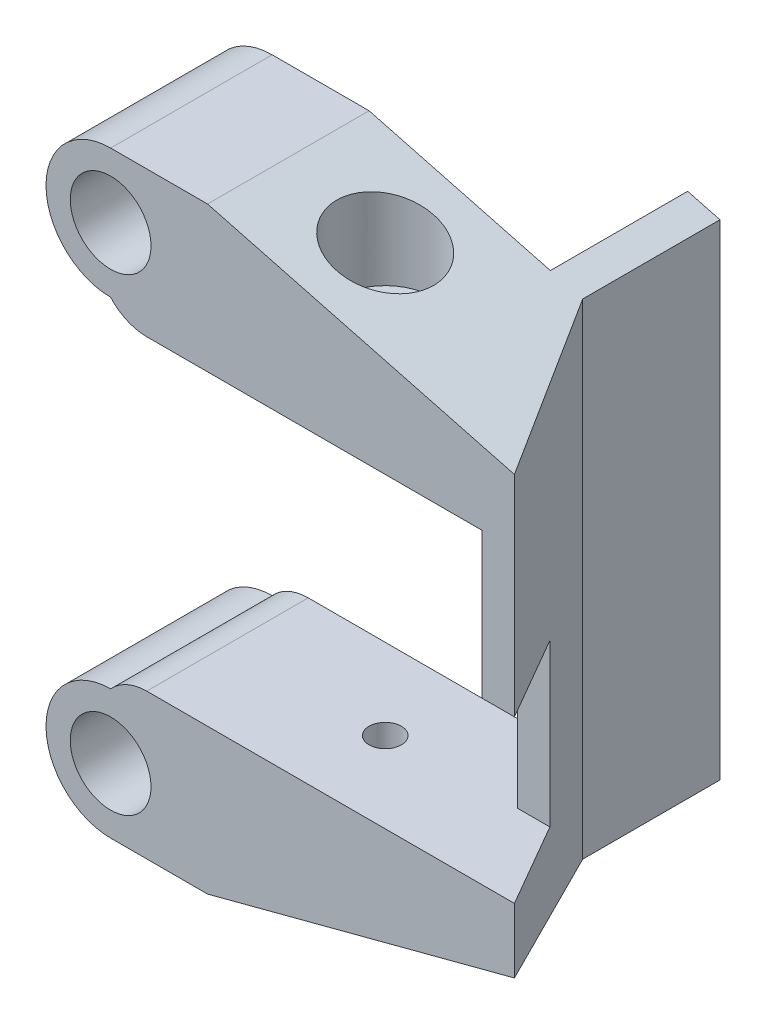
ISO-10303-21;
HEADER;
FILE_DESCRIPTION(('STEP AP214'),'2;1');
FILE_NAME('part.step','',(''),(''),'','','');
FILE_SCHEMA(('AUTOMOTIVE_DESIGN { 1 0 10303 214 1 1 1 1 }'));
ENDSEC;
DATA;
#1=APPLICATION_CONTEXT('core data for automotive mechanical design processes');
#2=APPLICATION_PROTOCOL_DEFINITION('international standard','automotive_design',2000,#1);
#3=PRODUCT_CONTEXT('',#1,'mechanical');
#4=PRODUCT('Part','Part','',(#3));
#5=PRODUCT_RELATED_PRODUCT_CATEGORY('part','',(#4));
#6=PRODUCT_DEFINITION_FORMATION('','',#4);
#7=PRODUCT_DEFINITION_CONTEXT('part definition',#1,'design');
#8=PRODUCT_DEFINITION('design','',#6,#7);
#9=PRODUCT_DEFINITION_SHAPE('','',#8);
#10=(LENGTH_UNIT() NAMED_UNIT(*) SI_UNIT(.MILLI.,.METRE.));
#11=(NAMED_UNIT(*) PLANE_ANGLE_UNIT() SI_UNIT($,.RADIAN.));
#12=(NAMED_UNIT(*) SI_UNIT($,.STERADIAN.) SOLID_ANGLE_UNIT());
#13=UNCERTAINTY_MEASURE_WITH_UNIT(LENGTH_MEASURE(1.E-05),#10,'distance_accuracy_value','');
#14=(GEOMETRIC_REPRESENTATION_CONTEXT(3) GLOBAL_UNCERTAINTY_ASSIGNED_CONTEXT((#13)) GLOBAL_UNIT_ASSIGNED_CONTEXT((#10,
#11,#12)) REPRESENTATION_CONTEXT('',''));
#15=CARTESIAN_POINT('',(0.,0.,0.));
#16=DIRECTION('',(0.,0.,1.));
#17=DIRECTION('',(1.,0.,0.));
#18=AXIS2_PLACEMENT_3D('',#15,#16,#17);
#19=CARTESIAN_POINT('',(-131.23163521819,17.7006515426684,10.));
#20=DIRECTION('',(0.,0.,1.));
#21=DIRECTION('',(1.,0.,0.));
#22=AXIS2_PLACEMENT_3D('',#19,#20,#21);
#23=PLANE('',#22);
#24=CARTESIAN_POINT('',(-131.23163521819,46.7006515426684,10.));
#25=DIRECTION('',(0.,0.,-1.));
#26=DIRECTION('',(1.,0.,0.));
#27=AXIS2_PLACEMENT_3D('',#24,#25,#26);
#28=CIRCLE('',#27,4.);
#29=CARTESIAN_POINT('',(-131.23163521819,42.7006515426684,10.));
#30=VERTEX_POINT('',#29);
#31=CARTESIAN_POINT('',(-131.23163521819,50.7006515426684,10.));
#32=VERTEX_POINT('',#31);
#33=EDGE_CURVE('E215',#30,#32,#28,.T.);
#34=ORIENTED_EDGE('',*,*,#33,.F.);
#35=CARTESIAN_POINT('',(-128.99556724069,44.7006515426684,10.));
#36=DIRECTION('',(0.,0.,1.));
#37=DIRECTION('',(1.,0.,0.));
#38=AXIS2_PLACEMENT_3D('',#35,#36,#37);
#39=CIRCLE('',#38,3.);
#40=CARTESIAN_POINT('',(-128.99556724069,41.7006515426684,10.));
#41=VERTEX_POINT('',#40);
#42=EDGE_CURVE('E203',#30,#41,#39,.T.);
#43=ORIENTED_EDGE('',*,*,#42,.T.);
#44=DIRECTION('',(-1.,0.,0.));
#45=VECTOR('',#44,1.);
#46=CARTESIAN_POINT('',(-106.23163521819,41.7006515426684,10.));
#47=LINE('',#46,#45);
#48=CARTESIAN_POINT('',(-108.23163521819,41.7006515426684,10.));
#49=VERTEX_POINT('',#48);
#50=EDGE_CURVE('E212',#49,#41,#47,.T.);
#51=ORIENTED_EDGE('',*,*,#50,.F.);
#52=DIRECTION('',(0.,-1.,0.));
#53=VECTOR('',#52,1.);
#54=CARTESIAN_POINT('',(-108.23163521819,32.2006515426684,10.));
#55=LINE('',#54,#53);
#56=CARTESIAN_POINT('',(-108.23163521819,32.7006515426684,10.));
#57=VERTEX_POINT('',#56);
#58=EDGE_CURVE('E195',#49,#57,#55,.T.);
#59=ORIENTED_EDGE('',*,*,#58,.T.);
#60=DIRECTION('',(-1.,0.,0.));
#61=VECTOR('',#60,1.);
#62=CARTESIAN_POINT('',(-108.23163521819,32.7006515426684,10.));
#63=LINE('',#62,#61);
#64=CARTESIAN_POINT('',(-106.23163521819,32.7006515426684,10.));
#65=VERTEX_POINT('',#64);
#66=EDGE_CURVE('E175',#65,#57,#63,.T.);
#67=ORIENTED_EDGE('',*,*,#66,.F.);
#68=DIRECTION('',(0.,1.,0.));
#69=VECTOR('',#68,1.);
#70=CARTESIAN_POINT('',(-106.23163521819,22.7006515426684,10.));
#71=LINE('',#70,#69);
#72=CARTESIAN_POINT('',(-106.23163521819,45.7006515426684,10.));
#73=VERTEX_POINT('',#72);
#74=EDGE_CURVE('E303',#65,#73,#71,.T.);
#75=ORIENTED_EDGE('',*,*,#74,.T.);
#76=DIRECTION('',(-0.967074537262646,0.254493299279644,0.));
#77=VECTOR('',#76,1.);
#78=CARTESIAN_POINT('',(-125.23163521819,50.7006515426684,10.));
#79=LINE('',#78,#77);
#80=CARTESIAN_POINT('',(-125.23163521819,50.7006515426684,10.));
#81=VERTEX_POINT('',#80);
#82=EDGE_CURVE('E718',#73,#81,#79,.T.);
#83=ORIENTED_EDGE('',*,*,#82,.T.);
#84=DIRECTION('',(1.,0.,0.));
#85=VECTOR('',#84,1.);
#86=CARTESIAN_POINT('',(-125.23163521819,50.7006515426684,10.));
#87=LINE('',#86,#85);
#88=EDGE_CURVE('E248',#32,#81,#87,.T.);
#89=ORIENTED_EDGE('',*,*,#88,.F.);
#90=EDGE_LOOP('',(#34,#43,#51,#59,#67,#75,#83,#89));
#91=FACE_BOUND('',#90,.T.);
#92=CARTESIAN_POINT('',(-131.23163521819,46.7006515426684,10.));
#93=DIRECTION('',(0.,0.,-1.));
#94=DIRECTION('',(1.,0.,0.));
#95=AXIS2_PLACEMENT_3D('',#92,#93,#94);
#96=CIRCLE('',#95,2.5);
#97=CARTESIAN_POINT('',(-128.73163521819,46.7006515426684,10.));
#98=VERTEX_POINT('',#97);
#99=EDGE_CURVE('E243',#98,#98,#96,.T.);
#100=ORIENTED_EDGE('',*,*,#99,.T.);
#101=EDGE_LOOP('',(#100));
#102=FACE_BOUND('',#101,.T.);
#103=ADVANCED_FACE('F33',(#91,#102),#23,.T.);
#104=CARTESIAN_POINT('',(-131.23163521819,17.7006515426684,0.));
#105=DIRECTION('',(0.,0.,1.));
#106=DIRECTION('',(1.,0.,0.));
#107=AXIS2_PLACEMENT_3D('',#104,#105,#106);
#108=PLANE('',#107);
#109=CARTESIAN_POINT('',(-131.23163521819,17.7006515426684,0.));
#110=DIRECTION('',(0.,0.,1.));
#111=DIRECTION('',(1.,0.,0.));
#112=AXIS2_PLACEMENT_3D('',#109,#110,#111);
#113=CIRCLE('',#112,2.5);
#114=CARTESIAN_POINT('',(-128.73163521819,17.7006515426684,0.));
#115=VERTEX_POINT('',#114);
#116=EDGE_CURVE('E291',#115,#115,#113,.T.);
#117=ORIENTED_EDGE('',*,*,#116,.T.);
#118=EDGE_LOOP('',(#117));
#119=FACE_BOUND('',#118,.T.);
#120=CARTESIAN_POINT('',(-131.23163521819,17.7006515426684,0.));
#121=DIRECTION('',(0.,0.,1.));
#122=DIRECTION('',(1.,0.,0.));
#123=AXIS2_PLACEMENT_3D('',#120,#121,#122);
#124=CIRCLE('',#123,4.);
#125=CARTESIAN_POINT('',(-131.23163521819,21.7006515426684,0.));
#126=VERTEX_POINT('',#125);
#127=CARTESIAN_POINT('',(-131.23163521819,13.7006515426684,0.));
#128=VERTEX_POINT('',#127);
#129=EDGE_CURVE('E311',#126,#128,#124,.T.);
#130=ORIENTED_EDGE('',*,*,#129,.F.);
#131=CARTESIAN_POINT('',(-128.99556724069,19.7006515426684,0.));
#132=DIRECTION('',(0.,0.,1.));
#133=DIRECTION('',(1.,0.,0.));
#134=AXIS2_PLACEMENT_3D('',#131,#132,#133);
#135=CIRCLE('',#134,3.);
#136=CARTESIAN_POINT('',(-128.99556724069,22.7006515426684,0.));
#137=VERTEX_POINT('',#136);
#138=EDGE_CURVE('E55',#126,#137,#135,.F.);
#139=ORIENTED_EDGE('',*,*,#138,.T.);
#140=DIRECTION('',(-1.,0.,0.));
#141=VECTOR('',#140,1.);
#142=CARTESIAN_POINT('',(-106.23163521819,22.7006515426684,0.));
#143=LINE('',#142,#141);
#144=CARTESIAN_POINT('',(-114.005137910086,22.7006515426684,0.));
#145=VERTEX_POINT('',#144);
#146=EDGE_CURVE('E296',#145,#137,#143,.T.);
#147=ORIENTED_EDGE('',*,*,#146,.F.);
#148=DIRECTION('',(0.,1.,0.));
#149=VECTOR('',#148,1.);
#150=CARTESIAN_POINT('',(-114.005137910086,32.2006515426684,0.));
#151=LINE('',#150,#149);
#152=CARTESIAN_POINT('',(-114.005137910086,16.6549929395378,0.));
#153=VERTEX_POINT('',#152);
#154=EDGE_CURVE('E251',#153,#145,#151,.T.);
#155=ORIENTED_EDGE('',*,*,#154,.F.);
#156=DIRECTION('',(-0.967074537262646,-0.254493299279644,0.));
#157=VECTOR('',#156,1.);
#158=CARTESIAN_POINT('',(-125.23163521819,13.7006515426684,0.));
#159=LINE('',#158,#157);
#160=CARTESIAN_POINT('',(-125.23163521819,13.7006515426684,0.));
#161=VERTEX_POINT('',#160);
#162=EDGE_CURVE('E276',#153,#161,#159,.T.);
#163=ORIENTED_EDGE('',*,*,#162,.T.);
#164=DIRECTION('',(1.,0.,0.));
#165=VECTOR('',#164,1.);
#166=CARTESIAN_POINT('',(-125.23163521819,13.7006515426684,0.));
#167=LINE('',#166,#165);
#168=EDGE_CURVE('E313',#128,#161,#167,.T.);
#169=ORIENTED_EDGE('',*,*,#168,.F.);
#170=EDGE_LOOP('',(#130,#139,#147,#155,#163,#169));
#171=FACE_BOUND('',#170,.T.);
#172=ADVANCED_FACE('F323',(#119,#171),#108,.F.);
#173=CARTESIAN_POINT('',(-119.23163521819,22.7006515426684,5.));
#174=DIRECTION('',(0.,-1.,0.));
#175=DIRECTION('',(0.,0.,-1.));
#176=AXIS2_PLACEMENT_3D('',#173,#174,#175);
#177=CYLINDRICAL_SURFACE('',#176,0.999999999999998);
#178=CARTESIAN_POINT('',(-119.23163521819,22.7006515426684,5.));
#179=DIRECTION('',(0.,-1.,0.));
#180=DIRECTION('',(0.,0.,-1.));
#181=AXIS2_PLACEMENT_3D('',#178,#179,#180);
#182=CIRCLE('',#181,0.999999999999998);
#183=CARTESIAN_POINT('',(-119.23163521819,22.7006515426684,4.));
#184=VERTEX_POINT('',#183);
#185=EDGE_CURVE('E288',#184,#184,#182,.T.);
#186=ORIENTED_EDGE('',*,*,#185,.F.);
#187=EDGE_LOOP('',(#186));
#188=FACE_BOUND('',#187,.T.);
#189=CARTESIAN_POINT('',(-119.23163521819,19.7006515426684,5.));
#190=DIRECTION('',(0.,-1.,0.));
#191=DIRECTION('',(0.,0.,-1.));
#192=AXIS2_PLACEMENT_3D('',#189,#190,#191);
#193=CIRCLE('',#192,0.999999999999998);
#194=CARTESIAN_POINT('',(-119.23163521819,19.7006515426684,4.));
#195=VERTEX_POINT('',#194);
#196=EDGE_CURVE('E192',#195,#195,#193,.F.);
#197=ORIENTED_EDGE('',*,*,#196,.F.);
#198=EDGE_LOOP('',(#197));
#199=FACE_BOUND('',#198,.T.);
#200=ADVANCED_FACE('F349',(#188,#199),#177,.F.);
#201=DIRECTION('',(-1.,0.,0.));
#202=VECTOR('',#201,1.);
#203=CARTESIAN_POINT('',(-106.23163521819,22.7006515426684,10.));
#204=LINE('',#203,#202);
#205=CARTESIAN_POINT('',(-106.23163521819,22.7006515426684,10.));
#206=VERTEX_POINT('',#205);
#207=CARTESIAN_POINT('',(-128.99556724069,22.7006515426684,10.));
#208=VERTEX_POINT('',#207);
#209=EDGE_CURVE('E302',#206,#208,#204,.T.);
#210=ORIENTED_EDGE('',*,*,#209,.T.);
#211=CARTESIAN_POINT('',(-128.99556724069,19.7006515426684,10.));
#212=DIRECTION('',(0.,0.,1.));
#213=DIRECTION('',(1.,0.,0.));
#214=AXIS2_PLACEMENT_3D('',#211,#212,#213);
#215=CIRCLE('',#214,3.);
#216=CARTESIAN_POINT('',(-131.23163521819,21.7006515426684,10.));
#217=VERTEX_POINT('',#216);
#218=EDGE_CURVE('E11',#208,#217,#215,.T.);
#219=ORIENTED_EDGE('',*,*,#218,.T.);
#220=CARTESIAN_POINT('',(-131.23163521819,17.7006515426684,10.));
#221=DIRECTION('',(0.,0.,1.));
#222=DIRECTION('',(1.,0.,0.));
#223=AXIS2_PLACEMENT_3D('',#220,#221,#222);
#224=CIRCLE('',#223,4.);
#225=CARTESIAN_POINT('',(-131.23163521819,13.7006515426684,10.));
#226=VERTEX_POINT('',#225);
#227=EDGE_CURVE('E305',#217,#226,#224,.T.);
#228=ORIENTED_EDGE('',*,*,#227,.T.);
#229=DIRECTION('',(1.,0.,0.));
#230=VECTOR('',#229,1.);
#231=CARTESIAN_POINT('',(-125.23163521819,13.7006515426684,10.));
#232=LINE('',#231,#230);
#233=CARTESIAN_POINT('',(-125.23163521819,13.7006515426684,10.));
#234=VERTEX_POINT('',#233);
#235=EDGE_CURVE('E307',#226,#234,#232,.T.);
#236=ORIENTED_EDGE('',*,*,#235,.T.);
#237=DIRECTION('',(-0.967074537262646,-0.254493299279644,0.));
#238=VECTOR('',#237,1.);
#239=CARTESIAN_POINT('',(-125.23163521819,13.7006515426684,10.));
#240=LINE('',#239,#238);
#241=CARTESIAN_POINT('',(-106.23163521819,18.7006515426684,10.));
#242=VERTEX_POINT('',#241);
#243=EDGE_CURVE('E275',#242,#234,#240,.T.);
#244=ORIENTED_EDGE('',*,*,#243,.F.);
#245=EDGE_CURVE('E299',#242,#206,#71,.T.);
#246=ORIENTED_EDGE('',*,*,#245,.T.);
#247=EDGE_LOOP('',(#210,#219,#228,#236,#244,#246));
#248=FACE_BOUND('',#247,.T.);
#249=CARTESIAN_POINT('',(-131.23163521819,17.7006515426684,10.));
#250=DIRECTION('',(0.,0.,1.));
#251=DIRECTION('',(1.,0.,0.));
#252=AXIS2_PLACEMENT_3D('',#249,#250,#251);
#253=CIRCLE('',#252,2.5);
#254=CARTESIAN_POINT('',(-128.73163521819,17.7006515426684,10.));
#255=VERTEX_POINT('',#254);
#256=EDGE_CURVE('E293',#255,#255,#253,.T.);
#257=ORIENTED_EDGE('',*,*,#256,.F.);
#258=EDGE_LOOP('',(#257));
#259=FACE_BOUND('',#258,.T.);
#260=ADVANCED_FACE('F332',(#248,#259),#23,.T.);
#261=CARTESIAN_POINT('',(-106.23163521819,22.7006515426684,10.));
#262=DIRECTION('',(0.,-1.,0.));
#263=DIRECTION('',(0.,0.,-1.));
#264=AXIS2_PLACEMENT_3D('',#261,#262,#263);
#265=PLANE('',#264);
#266=ORIENTED_EDGE('',*,*,#185,.T.);
#267=EDGE_LOOP('',(#266));
#268=FACE_BOUND('',#267,.T.);
#269=ORIENTED_EDGE('',*,*,#146,.T.);
#270=DIRECTION('',(0.,0.,-1.));
#271=VECTOR('',#270,1.);
#272=CARTESIAN_POINT('',(-128.99556724069,22.7006515426684,10.));
#273=LINE('',#272,#271);
#274=EDGE_CURVE('E41',#137,#208,#273,.F.);
#275=ORIENTED_EDGE('',*,*,#274,.T.);
#276=ORIENTED_EDGE('',*,*,#209,.F.);
#277=DIRECTION('',(0.499999999999995,0.,0.866025403784441));
#278=VECTOR('',#277,1.);
#279=CARTESIAN_POINT('',(-109.23163521819,22.7006515426684,4.80384757729335));
#280=LINE('',#279,#278);
#281=CARTESIAN_POINT('',(-109.23163521819,22.7006515426684,4.80384757729335));
#282=VERTEX_POINT('',#281);
#283=EDGE_CURVE('E162',#282,#206,#280,.T.);
#284=ORIENTED_EDGE('',*,*,#283,.F.);
#285=DIRECTION('',(1.,0.,0.));
#286=VECTOR('',#285,1.);
#287=CARTESIAN_POINT('',(-111.23163521819,22.7006515426684,4.80384757729335));
#288=LINE('',#287,#286);
#289=CARTESIAN_POINT('',(-111.23163521819,22.7006515426684,4.80384757729335));
#290=VERTEX_POINT('',#289);
#291=EDGE_CURVE('E155',#290,#282,#288,.T.);
#292=ORIENTED_EDGE('',*,*,#291,.F.);
#293=DIRECTION('',(-0.499999999999995,0.,-0.866025403784442));
#294=VECTOR('',#293,1.);
#295=CARTESIAN_POINT('',(-107.73163521819,22.7006515426684,10.8660254037844));
#296=LINE('',#295,#294);
#297=EDGE_CURVE('E159',#290,#145,#296,.T.);
#298=ORIENTED_EDGE('',*,*,#297,.T.);
#299=EDGE_LOOP('',(#269,#275,#276,#284,#292,#298));
#300=FACE_BOUND('',#299,.T.);
#301=ADVANCED_FACE('F157',(#268,#300),#265,.F.);
#302=CARTESIAN_POINT('',(-131.23163521819,17.7006515426684,10.));
#303=DIRECTION('',(0.,0.,-1.));
#304=DIRECTION('',(-1.,0.,0.));
#305=AXIS2_PLACEMENT_3D('',#302,#303,#304);
#306=CYLINDRICAL_SURFACE('',#305,4.);
#307=ORIENTED_EDGE('',*,*,#129,.T.);
#308=DIRECTION('',(0.,0.,-1.));
#309=VECTOR('',#308,1.);
#310=CARTESIAN_POINT('',(-131.23163521819,13.7006515426684,10.));
#311=LINE('',#310,#309);
#312=EDGE_CURVE('E188',#226,#128,#311,.T.);
#313=ORIENTED_EDGE('',*,*,#312,.F.);
#314=ORIENTED_EDGE('',*,*,#227,.F.);
#315=DIRECTION('',(0.,0.,-1.));
#316=VECTOR('',#315,1.);
#317=CARTESIAN_POINT('',(-131.23163521819,21.7006515426684,10.));
#318=LINE('',#317,#316);
#319=EDGE_CURVE('E182',#217,#126,#318,.T.);
#320=ORIENTED_EDGE('',*,*,#319,.T.);
#321=EDGE_LOOP('',(#307,#313,#314,#320));
#322=FACE_BOUND('',#321,.T.);
#323=ADVANCED_FACE('F337',(#322),#306,.T.);
#324=CARTESIAN_POINT('',(-125.23163521819,13.7006515426684,10.));
#325=DIRECTION('',(0.,1.,0.));
#326=DIRECTION('',(0.,0.,1.));
#327=AXIS2_PLACEMENT_3D('',#324,#325,#326);
#328=PLANE('',#327);
#329=ORIENTED_EDGE('',*,*,#168,.T.);
#330=DIRECTION('',(0.,0.,1.));
#331=VECTOR('',#330,1.);
#332=CARTESIAN_POINT('',(-125.23163521819,13.7006515426684,0.));
#333=LINE('',#332,#331);
#334=EDGE_CURVE('E200',#161,#234,#333,.T.);
#335=ORIENTED_EDGE('',*,*,#334,.T.);
#336=ORIENTED_EDGE('',*,*,#235,.F.);
#337=ORIENTED_EDGE('',*,*,#312,.T.);
#338=EDGE_LOOP('',(#329,#335,#336,#337));
#339=FACE_BOUND('',#338,.T.);
#340=ADVANCED_FACE('F320',(#339),#328,.F.);
#341=CARTESIAN_POINT('',(-131.23163521819,17.7006515426684,10.));
#342=DIRECTION('',(0.,0.,-1.));
#343=DIRECTION('',(-1.,0.,0.));
#344=AXIS2_PLACEMENT_3D('',#341,#342,#343);
#345=CYLINDRICAL_SURFACE('',#344,2.5);
#346=ORIENTED_EDGE('',*,*,#256,.T.);
#347=EDGE_LOOP('',(#346));
#348=FACE_BOUND('',#347,.T.);
#349=ORIENTED_EDGE('',*,*,#116,.F.);
#350=EDGE_LOOP('',(#349));
#351=FACE_BOUND('',#350,.T.);
#352=ADVANCED_FACE('F372',(#348,#351),#345,.F.);
#353=CARTESIAN_POINT('',(-106.23163521819,22.7006515426684,9.99999999999999));
#354=DIRECTION('',(-0.866025403784442,0.,0.499999999999995));
#355=DIRECTION('',(0.499999999999995,0.,0.866025403784442));
#356=AXIS2_PLACEMENT_3D('',#353,#354,#355);
#357=PLANE('',#356);
#358=ORIENTED_EDGE('',*,*,#74,.F.);
#359=DIRECTION('',(0.499999999999995,0.,0.866025403784441));
#360=VECTOR('',#359,1.);
#361=CARTESIAN_POINT('',(-109.23163521819,32.7006515426684,4.80384757729335));
#362=LINE('',#361,#360);
#363=CARTESIAN_POINT('',(-109.23163521819,32.7006515426684,4.80384757729335));
#364=VERTEX_POINT('',#363);
#365=EDGE_CURVE('E705',#364,#65,#362,.T.);
#366=ORIENTED_EDGE('',*,*,#365,.F.);
#367=DIRECTION('',(0.,1.,0.));
#368=VECTOR('',#367,1.);
#369=CARTESIAN_POINT('',(-109.23163521819,22.7006515426684,4.80384757729335));
#370=LINE('',#369,#368);
#371=EDGE_CURVE('E165',#282,#364,#370,.T.);
#372=ORIENTED_EDGE('',*,*,#371,.F.);
#373=ORIENTED_EDGE('',*,*,#283,.T.);
#374=ORIENTED_EDGE('',*,*,#245,.F.);
#375=DIRECTION('',(-0.495727147771267,-0.130454512571386,-0.858624606631051));
#376=VECTOR('',#375,1.);
#377=CARTESIAN_POINT('',(-105.972955844466,18.7687250620693,10.4480458181594));
#378=LINE('',#377,#376);
#379=CARTESIAN_POINT('',(-112.005137910086,17.1813087290115,0.));
#380=VERTEX_POINT('',#379);
#381=EDGE_CURVE('E199',#242,#380,#378,.T.);
#382=ORIENTED_EDGE('',*,*,#381,.T.);
#383=DIRECTION('',(0.,-1.,0.));
#384=VECTOR('',#383,1.);
#385=CARTESIAN_POINT('',(-112.005137910086,22.7006515426684,0.));
#386=LINE('',#385,#384);
#387=CARTESIAN_POINT('',(-112.005137910086,47.2199943563253,0.));
#388=VERTEX_POINT('',#387);
#389=EDGE_CURVE('E286',#388,#380,#386,.T.);
#390=ORIENTED_EDGE('',*,*,#389,.F.);
#391=DIRECTION('',(-0.495727147771267,0.130454512571386,-0.858624606631051));
#392=VECTOR('',#391,1.);
#393=CARTESIAN_POINT('',(-105.972955844466,45.6325780232674,10.4480458181594));
#394=LINE('',#393,#392);
#395=EDGE_CURVE('E260',#73,#388,#394,.T.);
#396=ORIENTED_EDGE('',*,*,#395,.F.);
#397=EDGE_LOOP('',(#358,#366,#372,#373,#374,#382,#390,#396));
#398=FACE_BOUND('',#397,.T.);
#399=ADVANCED_FACE('F370',(#398),#357,.F.);
#400=CARTESIAN_POINT('',(-108.23163521819,32.2006515426684,10.));
#401=DIRECTION('',(-0.866025403784442,0.,0.499999999999995));
#402=DIRECTION('',(0.499999999999995,0.,0.866025403784442));
#403=AXIS2_PLACEMENT_3D('',#400,#401,#402);
#404=PLANE('',#403);
#405=DIRECTION('',(0.499999999999995,0.,0.866025403784441));
#406=VECTOR('',#405,1.);
#407=CARTESIAN_POINT('',(-111.23163521819,32.7006515426684,4.80384757729335));
#408=LINE('',#407,#406);
#409=CARTESIAN_POINT('',(-111.23163521819,32.7006515426684,4.80384757729335));
#410=VERTEX_POINT('',#409);
#411=EDGE_CURVE('E707',#410,#57,#408,.T.);
#412=ORIENTED_EDGE('',*,*,#411,.T.);
#413=ORIENTED_EDGE('',*,*,#58,.F.);
#414=DIRECTION('',(-0.499999999999995,0.,-0.866025403784442));
#415=VECTOR('',#414,1.);
#416=CARTESIAN_POINT('',(-107.73163521819,41.7006515426684,10.8660254037844));
#417=LINE('',#416,#415);
#418=CARTESIAN_POINT('',(-114.005137910086,41.7006515426684,0.));
#419=VERTEX_POINT('',#418);
#420=EDGE_CURVE('E224',#49,#419,#417,.T.);
#421=ORIENTED_EDGE('',*,*,#420,.T.);
#422=DIRECTION('',(0.,-1.,0.));
#423=VECTOR('',#422,1.);
#424=CARTESIAN_POINT('',(-114.005137910086,32.2006515426684,0.));
#425=LINE('',#424,#423);
#426=EDGE_CURVE('E180',#419,#145,#425,.T.);
#427=ORIENTED_EDGE('',*,*,#426,.T.);
#428=ORIENTED_EDGE('',*,*,#297,.F.);
#429=DIRECTION('',(0.,-1.,0.));
#430=VECTOR('',#429,1.);
#431=CARTESIAN_POINT('',(-111.23163521819,22.7006515426684,4.80384757729335));
#432=LINE('',#431,#430);
#433=EDGE_CURVE('E166',#410,#290,#432,.T.);
#434=ORIENTED_EDGE('',*,*,#433,.F.);
#435=EDGE_LOOP('',(#412,#413,#421,#427,#428,#434));
#436=FACE_BOUND('',#435,.T.);
#437=ADVANCED_FACE('F178',(#436),#404,.T.);
#438=CARTESIAN_POINT('',(-119.23163521819,19.7006515426684,5.));
#439=DIRECTION('',(0.,-1.,0.));
#440=DIRECTION('',(0.,0.,-1.));
#441=AXIS2_PLACEMENT_3D('',#438,#439,#440);
#442=PLANE('',#441);
#443=CARTESIAN_POINT('',(-119.23163521819,19.7006515426684,5.));
#444=DIRECTION('',(0.,-1.,0.));
#445=DIRECTION('',(0.,0.,-1.));
#446=AXIS2_PLACEMENT_3D('',#443,#444,#445);
#447=CIRCLE('',#446,3.00000000000001);
#448=CARTESIAN_POINT('',(-119.23163521819,19.7006515426684,1.99999999999999));
#449=VERTEX_POINT('',#448);
#450=EDGE_CURVE('E196',#449,#449,#447,.T.);
#451=ORIENTED_EDGE('',*,*,#450,.T.);
#452=EDGE_LOOP('',(#451));
#453=FACE_BOUND('',#452,.T.);
#454=ORIENTED_EDGE('',*,*,#196,.T.);
#455=EDGE_LOOP('',(#454));
#456=FACE_BOUND('',#455,.T.);
#457=ADVANCED_FACE('F533',(#453,#456),#442,.T.);
#458=CARTESIAN_POINT('',(-119.23163521819,19.7006515426684,5.));
#459=DIRECTION('',(0.,-1.,0.));
#460=DIRECTION('',(0.,0.,-1.));
#461=AXIS2_PLACEMENT_3D('',#458,#459,#460);
#462=CYLINDRICAL_SURFACE('',#461,3.00000000000001);
#463=CARTESIAN_POINT('',(-119.23163521819,15.2795989110894,5.));
#464=DIRECTION('',(-0.254493299279644,0.967074537262646,0.));
#465=DIRECTION('',(-0.967074537262647,-0.254493299279644,0.));
#466=AXIS2_PLACEMENT_3D('',#463,#464,#465);
#467=ELLIPSE('',#466,3.10213937437714,3.00000000000001);
#468=CARTESIAN_POINT('',(-122.23163521819,14.4901252268789,5.));
#469=VERTEX_POINT('',#468);
#470=EDGE_CURVE('E197',#469,#469,#467,.F.);
#471=ORIENTED_EDGE('',*,*,#470,.T.);
#472=EDGE_LOOP('',(#471));
#473=FACE_BOUND('',#472,.T.);
#474=ORIENTED_EDGE('',*,*,#450,.F.);
#475=EDGE_LOOP('',(#474));
#476=FACE_BOUND('',#475,.T.);
#477=ADVANCED_FACE('F528',(#473,#476),#462,.F.);
#478=CARTESIAN_POINT('',(-125.23163521819,13.7006515426684,0.));
#479=DIRECTION('',(-0.254493299279644,0.967074537262646,0.));
#480=DIRECTION('',(-0.967074537262647,-0.254493299279644,0.));
#481=AXIS2_PLACEMENT_3D('',#478,#479,#480);
#482=PLANE('',#481);
#483=ORIENTED_EDGE('',*,*,#470,.F.);
#484=EDGE_LOOP('',(#483));
#485=FACE_BOUND('',#484,.T.);
#486=ORIENTED_EDGE('',*,*,#243,.T.);
#487=ORIENTED_EDGE('',*,*,#334,.F.);
#488=ORIENTED_EDGE('',*,*,#162,.F.);
#489=DIRECTION('',(0.,0.,1.));
#490=VECTOR('',#489,1.);
#491=CARTESIAN_POINT('',(-114.005137910086,16.6549929395378,-8.5));
#492=LINE('',#491,#490);
#493=CARTESIAN_POINT('',(-114.005137910086,16.6549929395378,-8.5));
#494=VERTEX_POINT('',#493);
#495=EDGE_CURVE('E273',#494,#153,#492,.T.);
#496=ORIENTED_EDGE('',*,*,#495,.F.);
#497=DIRECTION('',(-0.967074537262646,-0.254493299279643,0.));
#498=VECTOR('',#497,1.);
#499=CARTESIAN_POINT('',(-114.005137910086,16.6549929395378,-8.5));
#500=LINE('',#499,#498);
#501=CARTESIAN_POINT('',(-112.005137910086,17.1813087290115,-8.5));
#502=VERTEX_POINT('',#501);
#503=EDGE_CURVE('E262',#502,#494,#500,.T.);
#504=ORIENTED_EDGE('',*,*,#503,.F.);
#505=DIRECTION('',(0.,0.,1.));
#506=VECTOR('',#505,1.);
#507=CARTESIAN_POINT('',(-112.005137910086,17.1813087290115,-8.5));
#508=LINE('',#507,#506);
#509=EDGE_CURVE('E269',#502,#380,#508,.T.);
#510=ORIENTED_EDGE('',*,*,#509,.T.);
#511=ORIENTED_EDGE('',*,*,#381,.F.);
#512=EDGE_LOOP('',(#486,#487,#488,#496,#504,#510,#511));
#513=FACE_BOUND('',#512,.T.);
#514=ADVANCED_FACE('F329',(#485,#513),#482,.F.);
#515=CARTESIAN_POINT('',(-114.005137910086,32.2006515426684,-8.5));
#516=DIRECTION('',(1.,0.,0.));
#517=DIRECTION('',(0.,0.,-1.));
#518=AXIS2_PLACEMENT_3D('',#515,#516,#517);
#519=PLANE('',#518);
#520=ORIENTED_EDGE('',*,*,#154,.T.);
#521=ORIENTED_EDGE('',*,*,#426,.F.);
#522=DIRECTION('',(0.,-1.,0.));
#523=VECTOR('',#522,1.);
#524=CARTESIAN_POINT('',(-114.005137910086,32.2006515426684,0.));
#525=LINE('',#524,#523);
#526=CARTESIAN_POINT('',(-114.005137910086,47.7463101457989,0.));
#527=VERTEX_POINT('',#526);
#528=EDGE_CURVE('E713',#527,#419,#525,.T.);
#529=ORIENTED_EDGE('',*,*,#528,.F.);
#530=DIRECTION('',(0.,0.,1.));
#531=VECTOR('',#530,1.);
#532=CARTESIAN_POINT('',(-114.005137910086,47.7463101457989,-8.5));
#533=LINE('',#532,#531);
#534=CARTESIAN_POINT('',(-114.005137910086,47.7463101457989,-8.5));
#535=VERTEX_POINT('',#534);
#536=EDGE_CURVE('E716',#535,#527,#533,.T.);
#537=ORIENTED_EDGE('',*,*,#536,.F.);
#538=DIRECTION('',(0.,1.,0.));
#539=VECTOR('',#538,1.);
#540=CARTESIAN_POINT('',(-114.005137910086,32.2006515426684,-8.5));
#541=LINE('',#540,#539);
#542=EDGE_CURVE('E265',#494,#535,#541,.T.);
#543=ORIENTED_EDGE('',*,*,#542,.F.);
#544=ORIENTED_EDGE('',*,*,#495,.T.);
#545=EDGE_LOOP('',(#520,#521,#529,#537,#543,#544));
#546=FACE_BOUND('',#545,.T.);
#547=ADVANCED_FACE('F509',(#546),#519,.F.);
#548=CARTESIAN_POINT('',(-112.005137910086,17.1813087290115,-8.5));
#549=DIRECTION('',(-1.,0.,0.));
#550=DIRECTION('',(0.,0.,1.));
#551=AXIS2_PLACEMENT_3D('',#548,#549,#550);
#552=PLANE('',#551);
#553=ORIENTED_EDGE('',*,*,#389,.T.);
#554=ORIENTED_EDGE('',*,*,#509,.F.);
#555=DIRECTION('',(0.,-1.,0.));
#556=VECTOR('',#555,1.);
#557=CARTESIAN_POINT('',(-112.005137910086,17.1813087290115,-8.5));
#558=LINE('',#557,#556);
#559=CARTESIAN_POINT('',(-112.005137910086,47.2199943563253,-8.5));
#560=VERTEX_POINT('',#559);
#561=EDGE_CURVE('E267',#560,#502,#558,.T.);
#562=ORIENTED_EDGE('',*,*,#561,.F.);
#563=DIRECTION('',(0.,0.,1.));
#564=VECTOR('',#563,1.);
#565=CARTESIAN_POINT('',(-112.005137910086,47.2199943563253,-8.5));
#566=LINE('',#565,#564);
#567=EDGE_CURVE('E699',#560,#388,#566,.T.);
#568=ORIENTED_EDGE('',*,*,#567,.T.);
#569=EDGE_LOOP('',(#553,#554,#562,#568));
#570=FACE_BOUND('',#569,.T.);
#571=ADVANCED_FACE('F497',(#570),#552,.F.);
#572=CARTESIAN_POINT('',(0.,0.,-8.5));
#573=DIRECTION('',(0.,0.,1.));
#574=DIRECTION('',(1.,0.,0.));
#575=AXIS2_PLACEMENT_3D('',#572,#573,#574);
#576=PLANE('',#575);
#577=ORIENTED_EDGE('',*,*,#503,.T.);
#578=ORIENTED_EDGE('',*,*,#542,.T.);
#579=DIRECTION('',(-0.967074537262646,0.254493299279643,0.));
#580=VECTOR('',#579,1.);
#581=CARTESIAN_POINT('',(-114.005137910086,47.7463101457989,-8.5));
#582=LINE('',#581,#580);
#583=EDGE_CURVE('E696',#560,#535,#582,.T.);
#584=ORIENTED_EDGE('',*,*,#583,.F.);
#585=ORIENTED_EDGE('',*,*,#561,.T.);
#586=EDGE_LOOP('',(#577,#578,#584,#585));
#587=FACE_BOUND('',#586,.T.);
#588=ADVANCED_FACE('F398',(#587),#576,.F.);
#589=CARTESIAN_POINT('',(-131.23163521819,46.7006515426684,0.));
#590=DIRECTION('',(0.,0.,1.));
#591=DIRECTION('',(1.,0.,0.));
#592=AXIS2_PLACEMENT_3D('',#589,#590,#591);
#593=PLANE('',#592);
#594=CARTESIAN_POINT('',(-131.23163521819,46.7006515426684,0.));
#595=DIRECTION('',(0.,0.,-1.));
#596=DIRECTION('',(1.,0.,0.));
#597=AXIS2_PLACEMENT_3D('',#594,#595,#596);
#598=CIRCLE('',#597,2.5);
#599=CARTESIAN_POINT('',(-128.73163521819,46.7006515426684,0.));
#600=VERTEX_POINT('',#599);
#601=EDGE_CURVE('E730',#600,#600,#598,.T.);
#602=ORIENTED_EDGE('',*,*,#601,.F.);
#603=EDGE_LOOP('',(#602));
#604=FACE_BOUND('',#603,.T.);
#605=DIRECTION('',(-1.,0.,0.));
#606=VECTOR('',#605,1.);
#607=CARTESIAN_POINT('',(-106.23163521819,41.7006515426684,0.));
#608=LINE('',#607,#606);
#609=CARTESIAN_POINT('',(-128.99556724069,41.7006515426684,0.));
#610=VERTEX_POINT('',#609);
#611=EDGE_CURVE('E236',#419,#610,#608,.T.);
#612=ORIENTED_EDGE('',*,*,#611,.T.);
#613=CARTESIAN_POINT('',(-128.99556724069,44.7006515426684,0.));
#614=DIRECTION('',(0.,0.,1.));
#615=DIRECTION('',(1.,0.,0.));
#616=AXIS2_PLACEMENT_3D('',#613,#614,#615);
#617=CIRCLE('',#616,3.);
#618=CARTESIAN_POINT('',(-131.23163521819,42.7006515426684,0.));
#619=VERTEX_POINT('',#618);
#620=EDGE_CURVE('E185',#610,#619,#617,.F.);
#621=ORIENTED_EDGE('',*,*,#620,.T.);
#622=CARTESIAN_POINT('',(-131.23163521819,46.7006515426684,0.));
#623=DIRECTION('',(0.,0.,-1.));
#624=DIRECTION('',(1.,0.,0.));
#625=AXIS2_PLACEMENT_3D('',#622,#623,#624);
#626=CIRCLE('',#625,4.);
#627=CARTESIAN_POINT('',(-131.23163521819,50.7006515426684,0.));
#628=VERTEX_POINT('',#627);
#629=EDGE_CURVE('E234',#619,#628,#626,.T.);
#630=ORIENTED_EDGE('',*,*,#629,.T.);
#631=DIRECTION('',(1.,0.,0.));
#632=VECTOR('',#631,1.);
#633=CARTESIAN_POINT('',(-125.23163521819,50.7006515426684,0.));
#634=LINE('',#633,#632);
#635=CARTESIAN_POINT('',(-125.23163521819,50.7006515426684,0.));
#636=VERTEX_POINT('',#635);
#637=EDGE_CURVE('E225',#628,#636,#634,.T.);
#638=ORIENTED_EDGE('',*,*,#637,.T.);
#639=DIRECTION('',(-0.967074537262646,0.254493299279644,0.));
#640=VECTOR('',#639,1.);
#641=CARTESIAN_POINT('',(-125.23163521819,50.7006515426684,0.));
#642=LINE('',#641,#640);
#643=EDGE_CURVE('E719',#527,#636,#642,.T.);
#644=ORIENTED_EDGE('',*,*,#643,.F.);
#645=ORIENTED_EDGE('',*,*,#528,.T.);
#646=EDGE_LOOP('',(#612,#621,#630,#638,#644,#645));
#647=FACE_BOUND('',#646,.T.);
#648=ADVANCED_FACE('F232',(#604,#647),#593,.F.);
#649=CARTESIAN_POINT('',(-119.23163521819,41.7006515426684,5.));
#650=DIRECTION('',(0.,1.,0.));
#651=DIRECTION('',(0.,0.,-1.));
#652=AXIS2_PLACEMENT_3D('',#649,#650,#651);
#653=CYLINDRICAL_SURFACE('',#652,0.999999999999998);
#654=CARTESIAN_POINT('',(-119.23163521819,41.7006515426684,5.));
#655=DIRECTION('',(0.,-1.,0.));
#656=DIRECTION('',(0.,0.,-1.));
#657=AXIS2_PLACEMENT_3D('',#654,#655,#656);
#658=CIRCLE('',#657,0.999999999999998);
#659=CARTESIAN_POINT('',(-119.23163521819,41.7006515426684,4.));
#660=VERTEX_POINT('',#659);
#661=EDGE_CURVE('E255',#660,#660,#658,.T.);
#662=ORIENTED_EDGE('',*,*,#661,.T.);
#663=EDGE_LOOP('',(#662));
#664=FACE_BOUND('',#663,.T.);
#665=CARTESIAN_POINT('',(-119.23163521819,44.7006515426684,5.));
#666=DIRECTION('',(0.,-1.,0.));
#667=DIRECTION('',(0.,0.,-1.));
#668=AXIS2_PLACEMENT_3D('',#665,#666,#667);
#669=CIRCLE('',#668,0.999999999999998);
#670=CARTESIAN_POINT('',(-119.23163521819,44.7006515426684,4.));
#671=VERTEX_POINT('',#670);
#672=EDGE_CURVE('E252',#671,#671,#669,.F.);
#673=ORIENTED_EDGE('',*,*,#672,.T.);
#674=EDGE_LOOP('',(#673));
#675=FACE_BOUND('',#674,.T.);
#676=ADVANCED_FACE('F397',(#664,#675),#653,.F.);
#677=CARTESIAN_POINT('',(-106.23163521819,41.7006515426684,10.));
#678=DIRECTION('',(0.,1.,0.));
#679=DIRECTION('',(0.,0.,-1.));
#680=AXIS2_PLACEMENT_3D('',#677,#678,#679);
#681=PLANE('',#680);
#682=ORIENTED_EDGE('',*,*,#661,.F.);
#683=EDGE_LOOP('',(#682));
#684=FACE_BOUND('',#683,.T.);
#685=ORIENTED_EDGE('',*,*,#50,.T.);
#686=DIRECTION('',(0.,0.,-1.));
#687=VECTOR('',#686,1.);
#688=CARTESIAN_POINT('',(-128.99556724069,41.7006515426684,10.));
#689=LINE('',#688,#687);
#690=EDGE_CURVE('E181',#41,#610,#689,.T.);
#691=ORIENTED_EDGE('',*,*,#690,.T.);
#692=ORIENTED_EDGE('',*,*,#611,.F.);
#693=ORIENTED_EDGE('',*,*,#420,.F.);
#694=EDGE_LOOP('',(#685,#691,#692,#693));
#695=FACE_BOUND('',#694,.T.);
#696=ADVANCED_FACE('F221',(#684,#695),#681,.F.);
#697=CARTESIAN_POINT('',(-131.23163521819,46.7006515426684,10.));
#698=DIRECTION('',(0.,0.,-1.));
#699=DIRECTION('',(-1.,0.,0.));
#700=AXIS2_PLACEMENT_3D('',#697,#698,#699);
#701=CYLINDRICAL_SURFACE('',#700,4.);
#702=ORIENTED_EDGE('',*,*,#629,.F.);
#703=DIRECTION('',(0.,0.,-1.));
#704=VECTOR('',#703,1.);
#705=CARTESIAN_POINT('',(-131.23163521819,42.7006515426684,10.));
#706=LINE('',#705,#704);
#707=EDGE_CURVE('E228',#30,#619,#706,.T.);
#708=ORIENTED_EDGE('',*,*,#707,.F.);
#709=ORIENTED_EDGE('',*,*,#33,.T.);
#710=DIRECTION('',(0.,0.,-1.));
#711=VECTOR('',#710,1.);
#712=CARTESIAN_POINT('',(-131.23163521819,50.7006515426684,10.));
#713=LINE('',#712,#711);
#714=EDGE_CURVE('E239',#32,#628,#713,.T.);
#715=ORIENTED_EDGE('',*,*,#714,.T.);
#716=EDGE_LOOP('',(#702,#708,#709,#715));
#717=FACE_BOUND('',#716,.T.);
#718=ADVANCED_FACE('F238',(#717),#701,.T.);
#719=CARTESIAN_POINT('',(-125.23163521819,50.7006515426684,10.));
#720=DIRECTION('',(0.,-1.,0.));
#721=DIRECTION('',(0.,0.,1.));
#722=AXIS2_PLACEMENT_3D('',#719,#720,#721);
#723=PLANE('',#722);
#724=ORIENTED_EDGE('',*,*,#637,.F.);
#725=ORIENTED_EDGE('',*,*,#714,.F.);
#726=ORIENTED_EDGE('',*,*,#88,.T.);
#727=DIRECTION('',(0.,0.,1.));
#728=VECTOR('',#727,1.);
#729=CARTESIAN_POINT('',(-125.23163521819,50.7006515426684,0.));
#730=LINE('',#729,#728);
#731=EDGE_CURVE('E261',#636,#81,#730,.T.);
#732=ORIENTED_EDGE('',*,*,#731,.F.);
#733=EDGE_LOOP('',(#724,#725,#726,#732));
#734=FACE_BOUND('',#733,.T.);
#735=ADVANCED_FACE('F415',(#734),#723,.F.);
#736=CARTESIAN_POINT('',(-131.23163521819,46.7006515426684,10.));
#737=DIRECTION('',(0.,0.,-1.));
#738=DIRECTION('',(-1.,0.,0.));
#739=AXIS2_PLACEMENT_3D('',#736,#737,#738);
#740=CYLINDRICAL_SURFACE('',#739,2.5);
#741=ORIENTED_EDGE('',*,*,#99,.F.);
#742=EDGE_LOOP('',(#741));
#743=FACE_BOUND('',#742,.T.);
#744=ORIENTED_EDGE('',*,*,#601,.T.);
#745=EDGE_LOOP('',(#744));
#746=FACE_BOUND('',#745,.T.);
#747=ADVANCED_FACE('F465',(#743,#746),#740,.F.);
#748=CARTESIAN_POINT('',(-119.23163521819,44.7006515426684,5.));
#749=DIRECTION('',(0.,1.,0.));
#750=DIRECTION('',(0.,0.,-1.));
#751=AXIS2_PLACEMENT_3D('',#748,#749,#750);
#752=PLANE('',#751);
#753=CARTESIAN_POINT('',(-119.23163521819,44.7006515426684,5.));
#754=DIRECTION('',(0.,-1.,0.));
#755=DIRECTION('',(0.,0.,-1.));
#756=AXIS2_PLACEMENT_3D('',#753,#754,#755);
#757=CIRCLE('',#756,3.00000000000001);
#758=CARTESIAN_POINT('',(-119.23163521819,44.7006515426684,1.99999999999999));
#759=VERTEX_POINT('',#758);
#760=EDGE_CURVE('E256',#759,#759,#757,.T.);
#761=ORIENTED_EDGE('',*,*,#760,.F.);
#762=EDGE_LOOP('',(#761));
#763=FACE_BOUND('',#762,.T.);
#764=ORIENTED_EDGE('',*,*,#672,.F.);
#765=EDGE_LOOP('',(#764));
#766=FACE_BOUND('',#765,.T.);
#767=ADVANCED_FACE('F457',(#763,#766),#752,.T.);
#768=CARTESIAN_POINT('',(-119.23163521819,44.7006515426684,5.));
#769=DIRECTION('',(0.,1.,0.));
#770=DIRECTION('',(0.,0.,-1.));
#771=AXIS2_PLACEMENT_3D('',#768,#769,#770);
#772=CYLINDRICAL_SURFACE('',#771,3.00000000000001);
#773=CARTESIAN_POINT('',(-119.23163521819,49.1217041742473,5.));
#774=DIRECTION('',(0.254493299279644,0.967074537262646,0.));
#775=DIRECTION('',(-0.967074537262647,0.254493299279644,0.));
#776=AXIS2_PLACEMENT_3D('',#773,#774,#775);
#777=ELLIPSE('',#776,3.10213937437714,3.00000000000001);
#778=CARTESIAN_POINT('',(-122.23163521819,49.9111778584578,5.));
#779=VERTEX_POINT('',#778);
#780=EDGE_CURVE('E257',#779,#779,#777,.F.);
#781=ORIENTED_EDGE('',*,*,#780,.F.);
#782=EDGE_LOOP('',(#781));
#783=FACE_BOUND('',#782,.T.);
#784=ORIENTED_EDGE('',*,*,#760,.T.);
#785=EDGE_LOOP('',(#784));
#786=FACE_BOUND('',#785,.T.);
#787=ADVANCED_FACE('F448',(#783,#786),#772,.F.);
#788=CARTESIAN_POINT('',(-125.23163521819,50.7006515426684,0.));
#789=DIRECTION('',(-0.254493299279644,-0.967074537262646,0.));
#790=DIRECTION('',(-0.967074537262647,0.254493299279644,0.));
#791=AXIS2_PLACEMENT_3D('',#788,#789,#790);
#792=PLANE('',#791);
#793=ORIENTED_EDGE('',*,*,#780,.T.);
#794=EDGE_LOOP('',(#793));
#795=FACE_BOUND('',#794,.T.);
#796=ORIENTED_EDGE('',*,*,#82,.F.);
#797=ORIENTED_EDGE('',*,*,#395,.T.);
#798=ORIENTED_EDGE('',*,*,#567,.F.);
#799=ORIENTED_EDGE('',*,*,#583,.T.);
#800=ORIENTED_EDGE('',*,*,#536,.T.);
#801=ORIENTED_EDGE('',*,*,#643,.T.);
#802=ORIENTED_EDGE('',*,*,#731,.T.);
#803=EDGE_LOOP('',(#796,#797,#798,#799,#800,#801,#802));
#804=FACE_BOUND('',#803,.T.);
#805=ADVANCED_FACE('F439',(#795,#804),#792,.F.);
#806=CARTESIAN_POINT('',(-111.23163521819,32.7006515426684,4.80384757729335));
#807=DIRECTION('',(0.,1.,0.));
#808=DIRECTION('',(0.,0.,1.));
#809=AXIS2_PLACEMENT_3D('',#806,#807,#808);
#810=PLANE('',#809);
#811=ORIENTED_EDGE('',*,*,#66,.T.);
#812=ORIENTED_EDGE('',*,*,#411,.F.);
#813=DIRECTION('',(-1.,0.,0.));
#814=VECTOR('',#813,1.);
#815=CARTESIAN_POINT('',(-111.23163521819,32.7006515426684,4.80384757729335));
#816=LINE('',#815,#814);
#817=EDGE_CURVE('E171',#364,#410,#816,.T.);
#818=ORIENTED_EDGE('',*,*,#817,.F.);
#819=ORIENTED_EDGE('',*,*,#365,.T.);
#820=EDGE_LOOP('',(#811,#812,#818,#819));
#821=FACE_BOUND('',#820,.T.);
#822=ADVANCED_FACE('F433',(#821),#810,.F.);
#823=CARTESIAN_POINT('',(-2.99999999999997,0.,4.80384757729335));
#824=DIRECTION('',(0.,0.,-1.));
#825=DIRECTION('',(-1.,0.,0.));
#826=AXIS2_PLACEMENT_3D('',#823,#824,#825);
#827=PLANE('',#826);
#828=ORIENTED_EDGE('',*,*,#433,.T.);
#829=ORIENTED_EDGE('',*,*,#291,.T.);
#830=ORIENTED_EDGE('',*,*,#371,.T.);
#831=ORIENTED_EDGE('',*,*,#817,.T.);
#832=EDGE_LOOP('',(#828,#829,#830,#831));
#833=FACE_BOUND('',#832,.T.);
#834=ADVANCED_FACE('F169',(#833),#827,.F.);
#835=CARTESIAN_POINT('',(-128.99556724069,44.7006515426684,10.));
#836=DIRECTION('',(0.,0.,-1.));
#837=DIRECTION('',(-1.,0.,0.));
#838=AXIS2_PLACEMENT_3D('',#835,#836,#837);
#839=CYLINDRICAL_SURFACE('',#838,3.);
#840=ORIENTED_EDGE('',*,*,#42,.F.);
#841=ORIENTED_EDGE('',*,*,#707,.T.);
#842=ORIENTED_EDGE('',*,*,#620,.F.);
#843=ORIENTED_EDGE('',*,*,#690,.F.);
#844=EDGE_LOOP('',(#840,#841,#842,#843));
#845=FACE_BOUND('',#844,.T.);
#846=ADVANCED_FACE('F227',(#845),#839,.T.);
#847=CARTESIAN_POINT('',(-128.99556724069,19.7006515426684,10.));
#848=DIRECTION('',(0.,0.,-1.));
#849=DIRECTION('',(-1.,0.,0.));
#850=AXIS2_PLACEMENT_3D('',#847,#848,#849);
#851=CYLINDRICAL_SURFACE('',#850,3.);
#852=ORIENTED_EDGE('',*,*,#218,.F.);
#853=ORIENTED_EDGE('',*,*,#274,.F.);
#854=ORIENTED_EDGE('',*,*,#138,.F.);
#855=ORIENTED_EDGE('',*,*,#319,.F.);
#856=EDGE_LOOP('',(#852,#853,#854,#855));
#857=FACE_BOUND('',#856,.T.);
#858=ADVANCED_FACE('F35',(#857),#851,.T.);
#859=CLOSED_SHELL('',(#103,#172,#200,#260,#301,#323,#340,#352,#399,#437,#457,#477,#514,#547,
#571,#588,#648,#676,#696,#718,#735,#747,#767,#787,#805,#822,#834,#846,#858));
#860=MANIFOLD_SOLID_BREP('B2',#859);
#861=ADVANCED_BREP_SHAPE_REPRESENTATION('',(#18,#860),#14);
#862=SHAPE_DEFINITION_REPRESENTATION(#9,#861);
ENDSEC;
END-ISO-10303-21;
